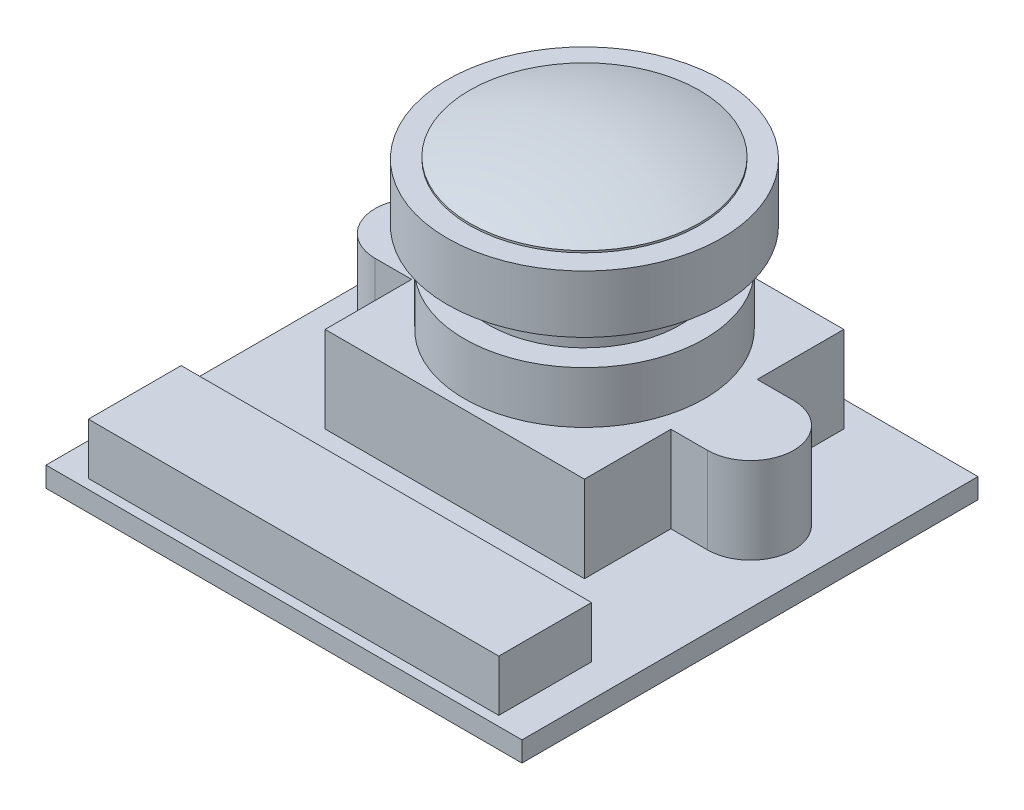
ISO-10303-21;
HEADER;
FILE_DESCRIPTION(('STEP AP214'),'2;1');
FILE_NAME('part.step','',(''),(''),'','','');
FILE_SCHEMA(('AUTOMOTIVE_DESIGN { 1 0 10303 214 1 1 1 1 }'));
ENDSEC;
DATA;
#1=APPLICATION_CONTEXT('core data for automotive mechanical design processes');
#2=APPLICATION_PROTOCOL_DEFINITION('international standard','automotive_design',2000,#1);
#3=PRODUCT_CONTEXT('',#1,'mechanical');
#4=PRODUCT('Part','Part','',(#3));
#5=PRODUCT_RELATED_PRODUCT_CATEGORY('part','',(#4));
#6=PRODUCT_DEFINITION_FORMATION('','',#4);
#7=PRODUCT_DEFINITION_CONTEXT('part definition',#1,'design');
#8=PRODUCT_DEFINITION('design','',#6,#7);
#9=PRODUCT_DEFINITION_SHAPE('','',#8);
#10=(LENGTH_UNIT() NAMED_UNIT(*) SI_UNIT(.MILLI.,.METRE.));
#11=(NAMED_UNIT(*) PLANE_ANGLE_UNIT() SI_UNIT($,.RADIAN.));
#12=(NAMED_UNIT(*) SI_UNIT($,.STERADIAN.) SOLID_ANGLE_UNIT());
#13=UNCERTAINTY_MEASURE_WITH_UNIT(LENGTH_MEASURE(1.E-05),#10,'distance_accuracy_value','');
#14=(GEOMETRIC_REPRESENTATION_CONTEXT(3) GLOBAL_UNCERTAINTY_ASSIGNED_CONTEXT((#13)) GLOBAL_UNIT_ASSIGNED_CONTEXT((#10,
#11,#12)) REPRESENTATION_CONTEXT('',''));
#15=CARTESIAN_POINT('',(0.,0.,0.));
#16=DIRECTION('',(0.,0.,1.));
#17=DIRECTION('',(1.,0.,0.));
#18=AXIS2_PLACEMENT_3D('',#15,#16,#17);
#19=CARTESIAN_POINT('',(0.,1.05,0.));
#20=DIRECTION('',(0.,-1.,0.));
#21=DIRECTION('',(0.,0.,-1.));
#22=AXIS2_PLACEMENT_3D('',#19,#20,#21);
#23=PLANE('',#22);
#24=DIRECTION('',(0.,0.,1.));
#25=VECTOR('',#24,1.);
#26=CARTESIAN_POINT('',(5.65,1.05,-22.44));
#27=LINE('',#26,#25);
#28=CARTESIAN_POINT('',(5.65,1.05,-22.44));
#29=VERTEX_POINT('',#28);
#30=CARTESIAN_POINT('',(5.65,1.05,-17.925));
#31=VERTEX_POINT('',#30);
#32=EDGE_CURVE('E63',#29,#31,#27,.T.);
#33=ORIENTED_EDGE('',*,*,#32,.F.);
#34=DIRECTION('',(-1.,0.,0.));
#35=VECTOR('',#34,1.);
#36=CARTESIAN_POINT('',(5.65,1.05,-22.44));
#37=LINE('',#36,#35);
#38=CARTESIAN_POINT('',(19.18,1.05,-22.44));
#39=VERTEX_POINT('',#38);
#40=EDGE_CURVE('E213',#39,#29,#37,.T.);
#41=ORIENTED_EDGE('',*,*,#40,.F.);
#42=DIRECTION('',(0.,0.,-1.));
#43=VECTOR('',#42,1.);
#44=CARTESIAN_POINT('',(19.18,1.05,-22.44));
#45=LINE('',#44,#43);
#46=CARTESIAN_POINT('',(19.18,1.05,-17.92));
#47=VERTEX_POINT('',#46);
#48=EDGE_CURVE('E262',#47,#39,#45,.T.);
#49=ORIENTED_EDGE('',*,*,#48,.F.);
#50=DIRECTION('',(-1.,0.,0.));
#51=VECTOR('',#50,1.);
#52=CARTESIAN_POINT('',(19.18,1.05,-17.92));
#53=LINE('',#52,#51);
#54=CARTESIAN_POINT('',(21.085,1.05,-17.92));
#55=VERTEX_POINT('',#54);
#56=EDGE_CURVE('E259',#55,#47,#53,.T.);
#57=ORIENTED_EDGE('',*,*,#56,.F.);
#58=CARTESIAN_POINT('',(21.085,1.05,-15.67));
#59=DIRECTION('',(0.,1.,0.));
#60=DIRECTION('',(0.,0.,1.));
#61=AXIS2_PLACEMENT_3D('',#58,#59,#60);
#62=CIRCLE('',#61,2.25);
#63=CARTESIAN_POINT('',(21.085,1.05,-13.42));
#64=VERTEX_POINT('',#63);
#65=EDGE_CURVE('E256',#64,#55,#62,.T.);
#66=ORIENTED_EDGE('',*,*,#65,.F.);
#67=DIRECTION('',(1.,0.,0.));
#68=VECTOR('',#67,1.);
#69=CARTESIAN_POINT('',(19.18,1.05,-13.42));
#70=LINE('',#69,#68);
#71=CARTESIAN_POINT('',(19.18,1.05,-13.42));
#72=VERTEX_POINT('',#71);
#73=EDGE_CURVE('E253',#72,#64,#70,.T.);
#74=ORIENTED_EDGE('',*,*,#73,.F.);
#75=DIRECTION('',(0.,0.,-1.));
#76=VECTOR('',#75,1.);
#77=CARTESIAN_POINT('',(19.18,1.05,-13.42));
#78=LINE('',#77,#76);
#79=CARTESIAN_POINT('',(19.18,1.05,-8.91));
#80=VERTEX_POINT('',#79);
#81=EDGE_CURVE('E250',#80,#72,#78,.T.);
#82=ORIENTED_EDGE('',*,*,#81,.F.);
#83=DIRECTION('',(1.,0.,0.));
#84=VECTOR('',#83,1.);
#85=CARTESIAN_POINT('',(5.65,1.05,-8.91));
#86=LINE('',#85,#84);
#87=CARTESIAN_POINT('',(5.65,1.05,-8.91));
#88=VERTEX_POINT('',#87);
#89=EDGE_CURVE('E247',#88,#80,#86,.T.);
#90=ORIENTED_EDGE('',*,*,#89,.F.);
#91=DIRECTION('',(0.,0.,1.));
#92=VECTOR('',#91,1.);
#93=CARTESIAN_POINT('',(5.65,1.05,-13.425));
#94=LINE('',#93,#92);
#95=CARTESIAN_POINT('',(5.65,1.05,-13.425));
#96=VERTEX_POINT('',#95);
#97=EDGE_CURVE('E244',#96,#88,#94,.T.);
#98=ORIENTED_EDGE('',*,*,#97,.F.);
#99=DIRECTION('',(1.,0.,0.));
#100=VECTOR('',#99,1.);
#101=CARTESIAN_POINT('',(3.745,1.05,-13.425));
#102=LINE('',#101,#100);
#103=CARTESIAN_POINT('',(3.745,1.05,-13.425));
#104=VERTEX_POINT('',#103);
#105=EDGE_CURVE('E241',#104,#96,#102,.T.);
#106=ORIENTED_EDGE('',*,*,#105,.F.);
#107=CARTESIAN_POINT('',(3.745,1.05,-15.675));
#108=DIRECTION('',(0.,1.,0.));
#109=DIRECTION('',(0.,0.,1.));
#110=AXIS2_PLACEMENT_3D('',#107,#108,#109);
#111=CIRCLE('',#110,2.25);
#112=CARTESIAN_POINT('',(3.745,1.05,-17.925));
#113=VERTEX_POINT('',#112);
#114=EDGE_CURVE('E238',#113,#104,#111,.T.);
#115=ORIENTED_EDGE('',*,*,#114,.F.);
#116=DIRECTION('',(-1.,0.,0.));
#117=VECTOR('',#116,1.);
#118=CARTESIAN_POINT('',(3.745,1.05,-17.925));
#119=LINE('',#118,#117);
#120=EDGE_CURVE('E203',#31,#113,#119,.T.);
#121=ORIENTED_EDGE('',*,*,#120,.F.);
#122=EDGE_LOOP('',(#33,#41,#49,#57,#66,#74,#82,#90,#98,#106,#115,#121));
#123=FACE_BOUND('',#122,.T.);
#124=DIRECTION('',(0.,0.,1.));
#125=VECTOR('',#124,1.);
#126=CARTESIAN_POINT('',(0.,1.05,0.));
#127=LINE('',#126,#125);
#128=CARTESIAN_POINT('',(0.,1.05,-23.79));
#129=VERTEX_POINT('',#128);
#130=CARTESIAN_POINT('',(0.,1.05,0.));
#131=VERTEX_POINT('',#130);
#132=EDGE_CURVE('E302',#129,#131,#127,.T.);
#133=ORIENTED_EDGE('',*,*,#132,.T.);
#134=DIRECTION('',(1.,0.,0.));
#135=VECTOR('',#134,1.);
#136=CARTESIAN_POINT('',(0.,1.05,0.));
#137=LINE('',#136,#135);
#138=CARTESIAN_POINT('',(24.83,1.05,0.));
#139=VERTEX_POINT('',#138);
#140=EDGE_CURVE('E305',#131,#139,#137,.T.);
#141=ORIENTED_EDGE('',*,*,#140,.T.);
#142=DIRECTION('',(0.,0.,-1.));
#143=VECTOR('',#142,1.);
#144=CARTESIAN_POINT('',(24.83,1.05,0.));
#145=LINE('',#144,#143);
#146=CARTESIAN_POINT('',(24.83,1.05,-23.79));
#147=VERTEX_POINT('',#146);
#148=EDGE_CURVE('E308',#139,#147,#145,.T.);
#149=ORIENTED_EDGE('',*,*,#148,.T.);
#150=DIRECTION('',(-1.,0.,0.));
#151=VECTOR('',#150,1.);
#152=CARTESIAN_POINT('',(0.,1.05,-23.79));
#153=LINE('',#152,#151);
#154=EDGE_CURVE('E310',#147,#129,#153,.T.);
#155=ORIENTED_EDGE('',*,*,#154,.T.);
#156=EDGE_LOOP('',(#133,#141,#149,#155));
#157=FACE_BOUND('',#156,.T.);
#158=DIRECTION('',(1.,0.,0.));
#159=VECTOR('',#158,1.);
#160=CARTESIAN_POINT('',(0.,1.05,-0.5));
#161=LINE('',#160,#159);
#162=CARTESIAN_POINT('',(1.71,1.05,-0.5));
#163=VERTEX_POINT('',#162);
#164=CARTESIAN_POINT('',(23.12,1.05,-0.5));
#165=VERTEX_POINT('',#164);
#166=EDGE_CURVE('E200',#163,#165,#161,.T.);
#167=ORIENTED_EDGE('',*,*,#166,.F.);
#168=DIRECTION('',(0.,0.,-1.));
#169=VECTOR('',#168,1.);
#170=CARTESIAN_POINT('',(1.71,1.05,0.));
#171=LINE('',#170,#169);
#172=CARTESIAN_POINT('',(1.71,1.05,-5.34));
#173=VERTEX_POINT('',#172);
#174=EDGE_CURVE('E196',#163,#173,#171,.T.);
#175=ORIENTED_EDGE('',*,*,#174,.T.);
#176=DIRECTION('',(1.,0.,0.));
#177=VECTOR('',#176,1.);
#178=CARTESIAN_POINT('',(0.,1.05,-5.34));
#179=LINE('',#178,#177);
#180=CARTESIAN_POINT('',(23.12,1.05,-5.34));
#181=VERTEX_POINT('',#180);
#182=EDGE_CURVE('E55',#173,#181,#179,.T.);
#183=ORIENTED_EDGE('',*,*,#182,.T.);
#184=DIRECTION('',(0.,0.,-1.));
#185=VECTOR('',#184,1.);
#186=CARTESIAN_POINT('',(23.12,1.05,0.));
#187=LINE('',#186,#185);
#188=EDGE_CURVE('E345',#165,#181,#187,.T.);
#189=ORIENTED_EDGE('',*,*,#188,.F.);
#190=EDGE_LOOP('',(#167,#175,#183,#189));
#191=FACE_BOUND('',#190,.T.);
#192=ADVANCED_FACE('F38',(#123,#157,#191),#23,.F.);
#193=CARTESIAN_POINT('',(0.,1.05,0.));
#194=DIRECTION('',(1.,0.,0.));
#195=DIRECTION('',(0.,0.,-1.));
#196=AXIS2_PLACEMENT_3D('',#193,#194,#195);
#197=PLANE('',#196);
#198=DIRECTION('',(0.,0.,1.));
#199=VECTOR('',#198,1.);
#200=CARTESIAN_POINT('',(0.,0.,0.));
#201=LINE('',#200,#199);
#202=CARTESIAN_POINT('',(0.,0.,-23.79));
#203=VERTEX_POINT('',#202);
#204=CARTESIAN_POINT('',(0.,0.,0.));
#205=VERTEX_POINT('',#204);
#206=EDGE_CURVE('E301',#203,#205,#201,.T.);
#207=ORIENTED_EDGE('',*,*,#206,.T.);
#208=DIRECTION('',(0.,-1.,0.));
#209=VECTOR('',#208,1.);
#210=CARTESIAN_POINT('',(0.,1.05,0.));
#211=LINE('',#210,#209);
#212=EDGE_CURVE('E327',#131,#205,#211,.T.);
#213=ORIENTED_EDGE('',*,*,#212,.F.);
#214=ORIENTED_EDGE('',*,*,#132,.F.);
#215=DIRECTION('',(0.,-1.,0.));
#216=VECTOR('',#215,1.);
#217=CARTESIAN_POINT('',(0.,1.05,-23.79));
#218=LINE('',#217,#216);
#219=EDGE_CURVE('E312',#129,#203,#218,.T.);
#220=ORIENTED_EDGE('',*,*,#219,.T.);
#221=EDGE_LOOP('',(#207,#213,#214,#220));
#222=FACE_BOUND('',#221,.T.);
#223=ADVANCED_FACE('F355',(#222),#197,.F.);
#224=CARTESIAN_POINT('',(0.,1.05,0.));
#225=DIRECTION('',(0.,0.,-1.));
#226=DIRECTION('',(-1.,0.,0.));
#227=AXIS2_PLACEMENT_3D('',#224,#225,#226);
#228=PLANE('',#227);
#229=DIRECTION('',(1.,0.,0.));
#230=VECTOR('',#229,1.);
#231=CARTESIAN_POINT('',(0.,0.,0.));
#232=LINE('',#231,#230);
#233=CARTESIAN_POINT('',(24.83,0.,0.));
#234=VERTEX_POINT('',#233);
#235=EDGE_CURVE('E315',#205,#234,#232,.T.);
#236=ORIENTED_EDGE('',*,*,#235,.T.);
#237=DIRECTION('',(0.,-1.,0.));
#238=VECTOR('',#237,1.);
#239=CARTESIAN_POINT('',(24.83,1.05,0.));
#240=LINE('',#239,#238);
#241=EDGE_CURVE('E325',#139,#234,#240,.T.);
#242=ORIENTED_EDGE('',*,*,#241,.F.);
#243=ORIENTED_EDGE('',*,*,#140,.F.);
#244=ORIENTED_EDGE('',*,*,#212,.T.);
#245=EDGE_LOOP('',(#236,#242,#243,#244));
#246=FACE_BOUND('',#245,.T.);
#247=ADVANCED_FACE('F360',(#246),#228,.F.);
#248=CARTESIAN_POINT('',(24.83,1.05,0.));
#249=DIRECTION('',(-1.,0.,0.));
#250=DIRECTION('',(0.,0.,1.));
#251=AXIS2_PLACEMENT_3D('',#248,#249,#250);
#252=PLANE('',#251);
#253=DIRECTION('',(0.,0.,-1.));
#254=VECTOR('',#253,1.);
#255=CARTESIAN_POINT('',(24.83,0.,0.));
#256=LINE('',#255,#254);
#257=CARTESIAN_POINT('',(24.83,0.,-23.79));
#258=VERTEX_POINT('',#257);
#259=EDGE_CURVE('E317',#234,#258,#256,.T.);
#260=ORIENTED_EDGE('',*,*,#259,.T.);
#261=DIRECTION('',(0.,-1.,0.));
#262=VECTOR('',#261,1.);
#263=CARTESIAN_POINT('',(24.83,1.05,-23.79));
#264=LINE('',#263,#262);
#265=EDGE_CURVE('E322',#147,#258,#264,.T.);
#266=ORIENTED_EDGE('',*,*,#265,.F.);
#267=ORIENTED_EDGE('',*,*,#148,.F.);
#268=ORIENTED_EDGE('',*,*,#241,.T.);
#269=EDGE_LOOP('',(#260,#266,#267,#268));
#270=FACE_BOUND('',#269,.T.);
#271=ADVANCED_FACE('F374',(#270),#252,.F.);
#272=CARTESIAN_POINT('',(0.,1.05,-23.79));
#273=DIRECTION('',(0.,0.,1.));
#274=DIRECTION('',(1.,0.,0.));
#275=AXIS2_PLACEMENT_3D('',#272,#273,#274);
#276=PLANE('',#275);
#277=DIRECTION('',(-1.,0.,0.));
#278=VECTOR('',#277,1.);
#279=CARTESIAN_POINT('',(0.,0.,-23.79));
#280=LINE('',#279,#278);
#281=EDGE_CURVE('E306',#258,#203,#280,.T.);
#282=ORIENTED_EDGE('',*,*,#281,.T.);
#283=ORIENTED_EDGE('',*,*,#219,.F.);
#284=ORIENTED_EDGE('',*,*,#154,.F.);
#285=ORIENTED_EDGE('',*,*,#265,.T.);
#286=EDGE_LOOP('',(#282,#283,#284,#285));
#287=FACE_BOUND('',#286,.T.);
#288=ADVANCED_FACE('F370',(#287),#276,.F.);
#289=CARTESIAN_POINT('',(0.,0.,0.));
#290=DIRECTION('',(0.,-1.,0.));
#291=DIRECTION('',(0.,0.,-1.));
#292=AXIS2_PLACEMENT_3D('',#289,#290,#291);
#293=PLANE('',#292);
#294=ORIENTED_EDGE('',*,*,#206,.F.);
#295=ORIENTED_EDGE('',*,*,#281,.F.);
#296=ORIENTED_EDGE('',*,*,#259,.F.);
#297=ORIENTED_EDGE('',*,*,#235,.F.);
#298=EDGE_LOOP('',(#294,#295,#296,#297));
#299=FACE_BOUND('',#298,.T.);
#300=ADVANCED_FACE('F367',(#299),#293,.T.);
#301=CARTESIAN_POINT('',(5.65,5.55,-22.44));
#302=DIRECTION('',(1.,0.,0.));
#303=DIRECTION('',(0.,0.,-1.));
#304=AXIS2_PLACEMENT_3D('',#301,#302,#303);
#305=PLANE('',#304);
#306=ORIENTED_EDGE('',*,*,#32,.T.);
#307=DIRECTION('',(0.,-1.,0.));
#308=VECTOR('',#307,1.);
#309=CARTESIAN_POINT('',(5.65,5.55,-17.925));
#310=LINE('',#309,#308);
#311=CARTESIAN_POINT('',(5.65,5.55,-17.925));
#312=VERTEX_POINT('',#311);
#313=EDGE_CURVE('E298',#312,#31,#310,.T.);
#314=ORIENTED_EDGE('',*,*,#313,.F.);
#315=DIRECTION('',(0.,0.,1.));
#316=VECTOR('',#315,1.);
#317=CARTESIAN_POINT('',(5.65,5.55,-22.44));
#318=LINE('',#317,#316);
#319=CARTESIAN_POINT('',(5.65,5.55,-22.44));
#320=VERTEX_POINT('',#319);
#321=EDGE_CURVE('E209',#320,#312,#318,.T.);
#322=ORIENTED_EDGE('',*,*,#321,.F.);
#323=DIRECTION('',(0.,-1.,0.));
#324=VECTOR('',#323,1.);
#325=CARTESIAN_POINT('',(5.65,5.55,-22.44));
#326=LINE('',#325,#324);
#327=EDGE_CURVE('E234',#320,#29,#326,.T.);
#328=ORIENTED_EDGE('',*,*,#327,.T.);
#329=EDGE_LOOP('',(#306,#314,#322,#328));
#330=FACE_BOUND('',#329,.T.);
#331=ADVANCED_FACE('F365',(#330),#305,.F.);
#332=CARTESIAN_POINT('',(3.745,5.55,-17.925));
#333=DIRECTION('',(0.,0.,1.));
#334=DIRECTION('',(1.,0.,0.));
#335=AXIS2_PLACEMENT_3D('',#332,#333,#334);
#336=PLANE('',#335);
#337=ORIENTED_EDGE('',*,*,#120,.T.);
#338=DIRECTION('',(0.,-1.,0.));
#339=VECTOR('',#338,1.);
#340=CARTESIAN_POINT('',(3.745,5.55,-17.925));
#341=LINE('',#340,#339);
#342=CARTESIAN_POINT('',(3.745,5.55,-17.925));
#343=VERTEX_POINT('',#342);
#344=EDGE_CURVE('E295',#343,#113,#341,.T.);
#345=ORIENTED_EDGE('',*,*,#344,.F.);
#346=DIRECTION('',(-1.,0.,0.));
#347=VECTOR('',#346,1.);
#348=CARTESIAN_POINT('',(3.745,5.55,-17.925));
#349=LINE('',#348,#347);
#350=EDGE_CURVE('E212',#312,#343,#349,.T.);
#351=ORIENTED_EDGE('',*,*,#350,.F.);
#352=ORIENTED_EDGE('',*,*,#313,.T.);
#353=EDGE_LOOP('',(#337,#345,#351,#352));
#354=FACE_BOUND('',#353,.T.);
#355=ADVANCED_FACE('F411',(#354),#336,.F.);
#356=CARTESIAN_POINT('',(3.745,5.55,-15.675));
#357=DIRECTION('',(0.,-1.,0.));
#358=DIRECTION('',(0.,0.,-1.));
#359=AXIS2_PLACEMENT_3D('',#356,#357,#358);
#360=CYLINDRICAL_SURFACE('',#359,2.25);
#361=ORIENTED_EDGE('',*,*,#114,.T.);
#362=DIRECTION('',(0.,-1.,0.));
#363=VECTOR('',#362,1.);
#364=CARTESIAN_POINT('',(3.745,5.55,-13.425));
#365=LINE('',#364,#363);
#366=CARTESIAN_POINT('',(3.745,5.55,-13.425));
#367=VERTEX_POINT('',#366);
#368=EDGE_CURVE('E292',#367,#104,#365,.T.);
#369=ORIENTED_EDGE('',*,*,#368,.F.);
#370=CARTESIAN_POINT('',(3.745,5.55,-15.675));
#371=DIRECTION('',(0.,1.,0.));
#372=DIRECTION('',(0.,0.,1.));
#373=AXIS2_PLACEMENT_3D('',#370,#371,#372);
#374=CIRCLE('',#373,2.25);
#375=EDGE_CURVE('E215',#343,#367,#374,.T.);
#376=ORIENTED_EDGE('',*,*,#375,.F.);
#377=ORIENTED_EDGE('',*,*,#344,.T.);
#378=EDGE_LOOP('',(#361,#369,#376,#377));
#379=FACE_BOUND('',#378,.T.);
#380=ADVANCED_FACE('F418',(#379),#360,.T.);
#381=CARTESIAN_POINT('',(3.745,5.55,-13.425));
#382=DIRECTION('',(0.,0.,-1.));
#383=DIRECTION('',(-1.,0.,0.));
#384=AXIS2_PLACEMENT_3D('',#381,#382,#383);
#385=PLANE('',#384);
#386=ORIENTED_EDGE('',*,*,#105,.T.);
#387=DIRECTION('',(0.,-1.,0.));
#388=VECTOR('',#387,1.);
#389=CARTESIAN_POINT('',(5.65,5.55,-13.425));
#390=LINE('',#389,#388);
#391=CARTESIAN_POINT('',(5.65,5.55,-13.425));
#392=VERTEX_POINT('',#391);
#393=EDGE_CURVE('E289',#392,#96,#390,.T.);
#394=ORIENTED_EDGE('',*,*,#393,.F.);
#395=DIRECTION('',(1.,0.,0.));
#396=VECTOR('',#395,1.);
#397=CARTESIAN_POINT('',(3.745,5.55,-13.425));
#398=LINE('',#397,#396);
#399=EDGE_CURVE('E217',#367,#392,#398,.T.);
#400=ORIENTED_EDGE('',*,*,#399,.F.);
#401=ORIENTED_EDGE('',*,*,#368,.T.);
#402=EDGE_LOOP('',(#386,#394,#400,#401));
#403=FACE_BOUND('',#402,.T.);
#404=ADVANCED_FACE('F425',(#403),#385,.F.);
#405=CARTESIAN_POINT('',(5.65,5.55,-13.425));
#406=DIRECTION('',(1.,0.,0.));
#407=DIRECTION('',(0.,0.,-1.));
#408=AXIS2_PLACEMENT_3D('',#405,#406,#407);
#409=PLANE('',#408);
#410=ORIENTED_EDGE('',*,*,#97,.T.);
#411=DIRECTION('',(0.,-1.,0.));
#412=VECTOR('',#411,1.);
#413=CARTESIAN_POINT('',(5.65,5.55,-8.91));
#414=LINE('',#413,#412);
#415=CARTESIAN_POINT('',(5.65,5.55,-8.91));
#416=VERTEX_POINT('',#415);
#417=EDGE_CURVE('E286',#416,#88,#414,.T.);
#418=ORIENTED_EDGE('',*,*,#417,.F.);
#419=DIRECTION('',(0.,0.,1.));
#420=VECTOR('',#419,1.);
#421=CARTESIAN_POINT('',(5.65,5.55,-13.425));
#422=LINE('',#421,#420);
#423=EDGE_CURVE('E219',#392,#416,#422,.T.);
#424=ORIENTED_EDGE('',*,*,#423,.F.);
#425=ORIENTED_EDGE('',*,*,#393,.T.);
#426=EDGE_LOOP('',(#410,#418,#424,#425));
#427=FACE_BOUND('',#426,.T.);
#428=ADVANCED_FACE('F433',(#427),#409,.F.);
#429=CARTESIAN_POINT('',(5.65,5.55,-8.91));
#430=DIRECTION('',(0.,0.,-1.));
#431=DIRECTION('',(-1.,0.,0.));
#432=AXIS2_PLACEMENT_3D('',#429,#430,#431);
#433=PLANE('',#432);
#434=ORIENTED_EDGE('',*,*,#89,.T.);
#435=DIRECTION('',(0.,-1.,0.));
#436=VECTOR('',#435,1.);
#437=CARTESIAN_POINT('',(19.18,5.55,-8.91));
#438=LINE('',#437,#436);
#439=CARTESIAN_POINT('',(19.18,5.55,-8.91));
#440=VERTEX_POINT('',#439);
#441=EDGE_CURVE('E283',#440,#80,#438,.T.);
#442=ORIENTED_EDGE('',*,*,#441,.F.);
#443=DIRECTION('',(1.,0.,0.));
#444=VECTOR('',#443,1.);
#445=CARTESIAN_POINT('',(5.65,5.55,-8.91));
#446=LINE('',#445,#444);
#447=EDGE_CURVE('E221',#416,#440,#446,.T.);
#448=ORIENTED_EDGE('',*,*,#447,.F.);
#449=ORIENTED_EDGE('',*,*,#417,.T.);
#450=EDGE_LOOP('',(#434,#442,#448,#449));
#451=FACE_BOUND('',#450,.T.);
#452=ADVANCED_FACE('F441',(#451),#433,.F.);
#453=CARTESIAN_POINT('',(19.18,5.55,-13.42));
#454=DIRECTION('',(-1.,0.,0.));
#455=DIRECTION('',(0.,0.,1.));
#456=AXIS2_PLACEMENT_3D('',#453,#454,#455);
#457=PLANE('',#456);
#458=ORIENTED_EDGE('',*,*,#81,.T.);
#459=DIRECTION('',(0.,-1.,0.));
#460=VECTOR('',#459,1.);
#461=CARTESIAN_POINT('',(19.18,5.55,-13.42));
#462=LINE('',#461,#460);
#463=CARTESIAN_POINT('',(19.18,5.55,-13.42));
#464=VERTEX_POINT('',#463);
#465=EDGE_CURVE('E280',#464,#72,#462,.T.);
#466=ORIENTED_EDGE('',*,*,#465,.F.);
#467=DIRECTION('',(0.,0.,-1.));
#468=VECTOR('',#467,1.);
#469=CARTESIAN_POINT('',(19.18,5.55,-13.42));
#470=LINE('',#469,#468);
#471=EDGE_CURVE('E223',#440,#464,#470,.T.);
#472=ORIENTED_EDGE('',*,*,#471,.F.);
#473=ORIENTED_EDGE('',*,*,#441,.T.);
#474=EDGE_LOOP('',(#458,#466,#472,#473));
#475=FACE_BOUND('',#474,.T.);
#476=ADVANCED_FACE('F449',(#475),#457,.F.);
#477=CARTESIAN_POINT('',(19.18,5.55,-13.42));
#478=DIRECTION('',(0.,0.,-1.));
#479=DIRECTION('',(-1.,0.,0.));
#480=AXIS2_PLACEMENT_3D('',#477,#478,#479);
#481=PLANE('',#480);
#482=ORIENTED_EDGE('',*,*,#73,.T.);
#483=DIRECTION('',(0.,-1.,0.));
#484=VECTOR('',#483,1.);
#485=CARTESIAN_POINT('',(21.085,5.55,-13.42));
#486=LINE('',#485,#484);
#487=CARTESIAN_POINT('',(21.085,5.55,-13.42));
#488=VERTEX_POINT('',#487);
#489=EDGE_CURVE('E277',#488,#64,#486,.T.);
#490=ORIENTED_EDGE('',*,*,#489,.F.);
#491=DIRECTION('',(1.,0.,0.));
#492=VECTOR('',#491,1.);
#493=CARTESIAN_POINT('',(19.18,5.55,-13.42));
#494=LINE('',#493,#492);
#495=EDGE_CURVE('E225',#464,#488,#494,.T.);
#496=ORIENTED_EDGE('',*,*,#495,.F.);
#497=ORIENTED_EDGE('',*,*,#465,.T.);
#498=EDGE_LOOP('',(#482,#490,#496,#497));
#499=FACE_BOUND('',#498,.T.);
#500=ADVANCED_FACE('F457',(#499),#481,.F.);
#501=CARTESIAN_POINT('',(21.085,5.55,-15.67));
#502=DIRECTION('',(0.,-1.,0.));
#503=DIRECTION('',(0.,0.,-1.));
#504=AXIS2_PLACEMENT_3D('',#501,#502,#503);
#505=CYLINDRICAL_SURFACE('',#504,2.25);
#506=ORIENTED_EDGE('',*,*,#65,.T.);
#507=DIRECTION('',(0.,-1.,0.));
#508=VECTOR('',#507,1.);
#509=CARTESIAN_POINT('',(21.085,5.55,-17.92));
#510=LINE('',#509,#508);
#511=CARTESIAN_POINT('',(21.085,5.55,-17.92));
#512=VERTEX_POINT('',#511);
#513=EDGE_CURVE('E274',#512,#55,#510,.T.);
#514=ORIENTED_EDGE('',*,*,#513,.F.);
#515=CARTESIAN_POINT('',(21.085,5.55,-15.67));
#516=DIRECTION('',(0.,1.,0.));
#517=DIRECTION('',(0.,0.,1.));
#518=AXIS2_PLACEMENT_3D('',#515,#516,#517);
#519=CIRCLE('',#518,2.25);
#520=EDGE_CURVE('E227',#488,#512,#519,.T.);
#521=ORIENTED_EDGE('',*,*,#520,.F.);
#522=ORIENTED_EDGE('',*,*,#489,.T.);
#523=EDGE_LOOP('',(#506,#514,#521,#522));
#524=FACE_BOUND('',#523,.T.);
#525=ADVANCED_FACE('F465',(#524),#505,.T.);
#526=CARTESIAN_POINT('',(19.18,5.55,-17.92));
#527=DIRECTION('',(0.,0.,1.));
#528=DIRECTION('',(1.,0.,0.));
#529=AXIS2_PLACEMENT_3D('',#526,#527,#528);
#530=PLANE('',#529);
#531=ORIENTED_EDGE('',*,*,#56,.T.);
#532=DIRECTION('',(0.,-1.,0.));
#533=VECTOR('',#532,1.);
#534=CARTESIAN_POINT('',(19.18,5.55,-17.92));
#535=LINE('',#534,#533);
#536=CARTESIAN_POINT('',(19.18,5.55,-17.92));
#537=VERTEX_POINT('',#536);
#538=EDGE_CURVE('E271',#537,#47,#535,.T.);
#539=ORIENTED_EDGE('',*,*,#538,.F.);
#540=DIRECTION('',(-1.,0.,0.));
#541=VECTOR('',#540,1.);
#542=CARTESIAN_POINT('',(19.18,5.55,-17.92));
#543=LINE('',#542,#541);
#544=EDGE_CURVE('E229',#512,#537,#543,.T.);
#545=ORIENTED_EDGE('',*,*,#544,.F.);
#546=ORIENTED_EDGE('',*,*,#513,.T.);
#547=EDGE_LOOP('',(#531,#539,#545,#546));
#548=FACE_BOUND('',#547,.T.);
#549=ADVANCED_FACE('F473',(#548),#530,.F.);
#550=CARTESIAN_POINT('',(19.18,5.55,-22.44));
#551=DIRECTION('',(-1.,0.,0.));
#552=DIRECTION('',(0.,0.,1.));
#553=AXIS2_PLACEMENT_3D('',#550,#551,#552);
#554=PLANE('',#553);
#555=ORIENTED_EDGE('',*,*,#48,.T.);
#556=DIRECTION('',(0.,-1.,0.));
#557=VECTOR('',#556,1.);
#558=CARTESIAN_POINT('',(19.18,5.55,-22.44));
#559=LINE('',#558,#557);
#560=CARTESIAN_POINT('',(19.18,5.55,-22.44));
#561=VERTEX_POINT('',#560);
#562=EDGE_CURVE('E268',#561,#39,#559,.T.);
#563=ORIENTED_EDGE('',*,*,#562,.F.);
#564=DIRECTION('',(0.,0.,-1.));
#565=VECTOR('',#564,1.);
#566=CARTESIAN_POINT('',(19.18,5.55,-22.44));
#567=LINE('',#566,#565);
#568=EDGE_CURVE('E231',#537,#561,#567,.T.);
#569=ORIENTED_EDGE('',*,*,#568,.F.);
#570=ORIENTED_EDGE('',*,*,#538,.T.);
#571=EDGE_LOOP('',(#555,#563,#569,#570));
#572=FACE_BOUND('',#571,.T.);
#573=ADVANCED_FACE('F481',(#572),#554,.F.);
#574=CARTESIAN_POINT('',(5.65,5.55,-22.44));
#575=DIRECTION('',(0.,0.,1.));
#576=DIRECTION('',(1.,0.,0.));
#577=AXIS2_PLACEMENT_3D('',#574,#575,#576);
#578=PLANE('',#577);
#579=ORIENTED_EDGE('',*,*,#40,.T.);
#580=ORIENTED_EDGE('',*,*,#327,.F.);
#581=DIRECTION('',(-1.,0.,0.));
#582=VECTOR('',#581,1.);
#583=CARTESIAN_POINT('',(5.65,5.55,-22.44));
#584=LINE('',#583,#582);
#585=EDGE_CURVE('E233',#561,#320,#584,.T.);
#586=ORIENTED_EDGE('',*,*,#585,.F.);
#587=ORIENTED_EDGE('',*,*,#562,.T.);
#588=EDGE_LOOP('',(#579,#580,#586,#587));
#589=FACE_BOUND('',#588,.T.);
#590=ADVANCED_FACE('F489',(#589),#578,.F.);
#591=CARTESIAN_POINT('',(3.745,5.55,-15.675));
#592=DIRECTION('',(0.,1.,0.));
#593=DIRECTION('',(0.,0.,1.));
#594=AXIS2_PLACEMENT_3D('',#591,#592,#593);
#595=PLANE('',#594);
#596=CARTESIAN_POINT('',(12.415,5.55,-15.675));
#597=DIRECTION('',(0.,1.,0.));
#598=DIRECTION('',(0.,0.,1.));
#599=AXIS2_PLACEMENT_3D('',#596,#597,#598);
#600=CIRCLE('',#599,6.265);
#601=CARTESIAN_POINT('',(12.415,5.55,-21.94));
#602=VERTEX_POINT('',#601);
#603=EDGE_CURVE('E329',#602,#602,#600,.T.);
#604=ORIENTED_EDGE('',*,*,#603,.F.);
#605=EDGE_LOOP('',(#604));
#606=FACE_BOUND('',#605,.T.);
#607=ORIENTED_EDGE('',*,*,#321,.T.);
#608=ORIENTED_EDGE('',*,*,#350,.T.);
#609=ORIENTED_EDGE('',*,*,#375,.T.);
#610=ORIENTED_EDGE('',*,*,#399,.T.);
#611=ORIENTED_EDGE('',*,*,#423,.T.);
#612=ORIENTED_EDGE('',*,*,#447,.T.);
#613=ORIENTED_EDGE('',*,*,#471,.T.);
#614=ORIENTED_EDGE('',*,*,#495,.T.);
#615=ORIENTED_EDGE('',*,*,#520,.T.);
#616=ORIENTED_EDGE('',*,*,#544,.T.);
#617=ORIENTED_EDGE('',*,*,#568,.T.);
#618=ORIENTED_EDGE('',*,*,#585,.T.);
#619=EDGE_LOOP('',(#607,#608,#609,#610,#611,#612,#613,#614,#615,#616,#617,#618));
#620=FACE_BOUND('',#619,.T.);
#621=ADVANCED_FACE('F497',(#606,#620),#595,.T.);
#622=CARTESIAN_POINT('',(0.,3.73,-0.5));
#623=DIRECTION('',(0.,0.,-1.));
#624=DIRECTION('',(-1.,0.,0.));
#625=AXIS2_PLACEMENT_3D('',#622,#623,#624);
#626=PLANE('',#625);
#627=ORIENTED_EDGE('',*,*,#166,.T.);
#628=DIRECTION('',(0.,-1.,0.));
#629=VECTOR('',#628,1.);
#630=CARTESIAN_POINT('',(23.12,3.73,-0.5));
#631=LINE('',#630,#629);
#632=CARTESIAN_POINT('',(23.12,3.73,-0.5));
#633=VERTEX_POINT('',#632);
#634=EDGE_CURVE('E181',#633,#165,#631,.T.);
#635=ORIENTED_EDGE('',*,*,#634,.F.);
#636=DIRECTION('',(1.,0.,0.));
#637=VECTOR('',#636,1.);
#638=CARTESIAN_POINT('',(0.,3.73,-0.5));
#639=LINE('',#638,#637);
#640=CARTESIAN_POINT('',(1.71,3.73,-0.5));
#641=VERTEX_POINT('',#640);
#642=EDGE_CURVE('E188',#641,#633,#639,.T.);
#643=ORIENTED_EDGE('',*,*,#642,.F.);
#644=DIRECTION('',(0.,-1.,0.));
#645=VECTOR('',#644,1.);
#646=CARTESIAN_POINT('',(1.71,3.73,-0.5));
#647=LINE('',#646,#645);
#648=EDGE_CURVE('E343',#641,#163,#647,.T.);
#649=ORIENTED_EDGE('',*,*,#648,.T.);
#650=EDGE_LOOP('',(#627,#635,#643,#649));
#651=FACE_BOUND('',#650,.T.);
#652=ADVANCED_FACE('F198',(#651),#626,.F.);
#653=CARTESIAN_POINT('',(23.12,3.73,0.));
#654=DIRECTION('',(-1.,0.,0.));
#655=DIRECTION('',(0.,0.,1.));
#656=AXIS2_PLACEMENT_3D('',#653,#654,#655);
#657=PLANE('',#656);
#658=ORIENTED_EDGE('',*,*,#188,.T.);
#659=DIRECTION('',(0.,-1.,0.));
#660=VECTOR('',#659,1.);
#661=CARTESIAN_POINT('',(23.12,3.73,-5.34));
#662=LINE('',#661,#660);
#663=CARTESIAN_POINT('',(23.12,3.73,-5.34));
#664=VERTEX_POINT('',#663);
#665=EDGE_CURVE('E183',#664,#181,#662,.T.);
#666=ORIENTED_EDGE('',*,*,#665,.F.);
#667=DIRECTION('',(0.,0.,-1.));
#668=VECTOR('',#667,1.);
#669=CARTESIAN_POINT('',(23.12,3.73,0.));
#670=LINE('',#669,#668);
#671=EDGE_CURVE('E176',#633,#664,#670,.T.);
#672=ORIENTED_EDGE('',*,*,#671,.F.);
#673=ORIENTED_EDGE('',*,*,#634,.T.);
#674=EDGE_LOOP('',(#658,#666,#672,#673));
#675=FACE_BOUND('',#674,.T.);
#676=ADVANCED_FACE('F179',(#675),#657,.F.);
#677=CARTESIAN_POINT('',(0.,3.73,-5.34));
#678=DIRECTION('',(0.,0.,-1.));
#679=DIRECTION('',(-1.,0.,0.));
#680=AXIS2_PLACEMENT_3D('',#677,#678,#679);
#681=PLANE('',#680);
#682=ORIENTED_EDGE('',*,*,#182,.F.);
#683=DIRECTION('',(0.,-1.,0.));
#684=VECTOR('',#683,1.);
#685=CARTESIAN_POINT('',(1.71,3.73,-5.34));
#686=LINE('',#685,#684);
#687=CARTESIAN_POINT('',(1.71,3.73,-5.34));
#688=VERTEX_POINT('',#687);
#689=EDGE_CURVE('E205',#688,#173,#686,.T.);
#690=ORIENTED_EDGE('',*,*,#689,.F.);
#691=DIRECTION('',(1.,0.,0.));
#692=VECTOR('',#691,1.);
#693=CARTESIAN_POINT('',(0.,3.73,-5.34));
#694=LINE('',#693,#692);
#695=EDGE_CURVE('E187',#688,#664,#694,.T.);
#696=ORIENTED_EDGE('',*,*,#695,.T.);
#697=ORIENTED_EDGE('',*,*,#665,.T.);
#698=EDGE_LOOP('',(#682,#690,#696,#697));
#699=FACE_BOUND('',#698,.T.);
#700=ADVANCED_FACE('F520',(#699),#681,.T.);
#701=CARTESIAN_POINT('',(1.71,3.73,0.));
#702=DIRECTION('',(-1.,0.,0.));
#703=DIRECTION('',(0.,0.,1.));
#704=AXIS2_PLACEMENT_3D('',#701,#702,#703);
#705=PLANE('',#704);
#706=ORIENTED_EDGE('',*,*,#174,.F.);
#707=ORIENTED_EDGE('',*,*,#648,.F.);
#708=DIRECTION('',(0.,0.,-1.));
#709=VECTOR('',#708,1.);
#710=CARTESIAN_POINT('',(1.71,3.73,0.));
#711=LINE('',#710,#709);
#712=EDGE_CURVE('E194',#641,#688,#711,.T.);
#713=ORIENTED_EDGE('',*,*,#712,.T.);
#714=ORIENTED_EDGE('',*,*,#689,.T.);
#715=EDGE_LOOP('',(#706,#707,#713,#714));
#716=FACE_BOUND('',#715,.T.);
#717=ADVANCED_FACE('F352',(#716),#705,.T.);
#718=CARTESIAN_POINT('',(0.,3.73,0.));
#719=DIRECTION('',(0.,1.,0.));
#720=DIRECTION('',(0.,0.,1.));
#721=AXIS2_PLACEMENT_3D('',#718,#719,#720);
#722=PLANE('',#721);
#723=ORIENTED_EDGE('',*,*,#642,.T.);
#724=ORIENTED_EDGE('',*,*,#671,.T.);
#725=ORIENTED_EDGE('',*,*,#695,.F.);
#726=ORIENTED_EDGE('',*,*,#712,.F.);
#727=EDGE_LOOP('',(#723,#724,#725,#726));
#728=FACE_BOUND('',#727,.T.);
#729=ADVANCED_FACE('F192',(#728),#722,.T.);
#730=CARTESIAN_POINT('',(12.415,8.25,-15.675));
#731=DIRECTION('',(0.,-1.,0.));
#732=DIRECTION('',(0.,0.,-1.));
#733=AXIS2_PLACEMENT_3D('',#730,#731,#732);
#734=CYLINDRICAL_SURFACE('',#733,6.265);
#735=CARTESIAN_POINT('',(12.415,8.25,-15.675));
#736=DIRECTION('',(0.,1.,0.));
#737=DIRECTION('',(0.,0.,1.));
#738=AXIS2_PLACEMENT_3D('',#735,#736,#737);
#739=CIRCLE('',#738,6.265);
#740=CARTESIAN_POINT('',(12.415,8.25,-21.94));
#741=VERTEX_POINT('',#740);
#742=EDGE_CURVE('E339',#741,#741,#739,.T.);
#743=CARTESIAN_POINT('',(12.415,8.25,-21.94));
#744=CARTESIAN_POINT('',(12.415,8.221875,-21.94));
#745=CARTESIAN_POINT('',(12.415,8.19375,-21.94));
#746=CARTESIAN_POINT('',(12.415,8.1375,-21.94));
#747=CARTESIAN_POINT('',(12.415,8.109375,-21.94));
#748=CARTESIAN_POINT('',(12.415,8.053125,-21.94));
#749=CARTESIAN_POINT('',(12.415,8.025,-21.94));
#750=CARTESIAN_POINT('',(12.415,7.96875,-21.94));
#751=CARTESIAN_POINT('',(12.415,7.940625,-21.94));
#752=CARTESIAN_POINT('',(12.415,7.884375,-21.94));
#753=CARTESIAN_POINT('',(12.415,7.85625,-21.94));
#754=CARTESIAN_POINT('',(12.415,7.8,-21.94));
#755=CARTESIAN_POINT('',(12.415,7.771875,-21.94));
#756=CARTESIAN_POINT('',(12.415,7.715625,-21.94));
#757=CARTESIAN_POINT('',(12.415,7.6875,-21.94));
#758=CARTESIAN_POINT('',(12.415,7.63125,-21.94));
#759=CARTESIAN_POINT('',(12.415,7.603125,-21.94));
#760=CARTESIAN_POINT('',(12.415,7.546875,-21.94));
#761=CARTESIAN_POINT('',(12.415,7.51875,-21.94));
#762=CARTESIAN_POINT('',(12.415,7.4625,-21.94));
#763=CARTESIAN_POINT('',(12.415,7.434375,-21.94));
#764=CARTESIAN_POINT('',(12.415,7.378125,-21.94));
#765=CARTESIAN_POINT('',(12.415,7.35,-21.94));
#766=CARTESIAN_POINT('',(12.415,7.29375,-21.94));
#767=CARTESIAN_POINT('',(12.415,7.265625,-21.94));
#768=CARTESIAN_POINT('',(12.415,7.209375,-21.94));
#769=CARTESIAN_POINT('',(12.415,7.18125,-21.94));
#770=CARTESIAN_POINT('',(12.415,7.125,-21.94));
#771=CARTESIAN_POINT('',(12.415,7.096875,-21.94));
#772=CARTESIAN_POINT('',(12.415,7.040625,-21.94));
#773=CARTESIAN_POINT('',(12.415,7.0125,-21.94));
#774=CARTESIAN_POINT('',(12.415,6.95625,-21.94));
#775=CARTESIAN_POINT('',(12.415,6.928125,-21.94));
#776=CARTESIAN_POINT('',(12.415,6.871875,-21.94));
#777=CARTESIAN_POINT('',(12.415,6.84375,-21.94));
#778=CARTESIAN_POINT('',(12.415,6.7875,-21.94));
#779=CARTESIAN_POINT('',(12.415,6.759375,-21.94));
#780=CARTESIAN_POINT('',(12.415,6.703125,-21.94));
#781=CARTESIAN_POINT('',(12.415,6.675,-21.94));
#782=CARTESIAN_POINT('',(12.415,6.61875,-21.94));
#783=CARTESIAN_POINT('',(12.415,6.590625,-21.94));
#784=CARTESIAN_POINT('',(12.415,6.534375,-21.94));
#785=CARTESIAN_POINT('',(12.415,6.50625,-21.94));
#786=CARTESIAN_POINT('',(12.415,6.45,-21.94));
#787=CARTESIAN_POINT('',(12.415,6.421875,-21.94));
#788=CARTESIAN_POINT('',(12.415,6.365625,-21.94));
#789=CARTESIAN_POINT('',(12.415,6.3375,-21.94));
#790=CARTESIAN_POINT('',(12.415,6.28125,-21.94));
#791=CARTESIAN_POINT('',(12.415,6.253125,-21.94));
#792=CARTESIAN_POINT('',(12.415,6.196875,-21.94));
#793=CARTESIAN_POINT('',(12.415,6.16875,-21.94));
#794=CARTESIAN_POINT('',(12.415,6.1125,-21.94));
#795=CARTESIAN_POINT('',(12.415,6.084375,-21.94));
#796=CARTESIAN_POINT('',(12.415,6.028125,-21.94));
#797=CARTESIAN_POINT('',(12.415,6.,-21.94));
#798=CARTESIAN_POINT('',(12.415,5.94375,-21.94));
#799=CARTESIAN_POINT('',(12.415,5.915625,-21.94));
#800=CARTESIAN_POINT('',(12.415,5.859375,-21.94));
#801=CARTESIAN_POINT('',(12.415,5.83125,-21.94));
#802=CARTESIAN_POINT('',(12.415,5.775,-21.94));
#803=CARTESIAN_POINT('',(12.415,5.746875,-21.94));
#804=CARTESIAN_POINT('',(12.415,5.690625,-21.94));
#805=CARTESIAN_POINT('',(12.415,5.6625,-21.94));
#806=CARTESIAN_POINT('',(12.415,5.60625,-21.94));
#807=CARTESIAN_POINT('',(12.415,5.578125,-21.94));
#808=CARTESIAN_POINT('',(12.415,5.55,-21.94));
#809=B_SPLINE_CURVE_WITH_KNOTS('',3,(#743,#744,#745,#746,#747,#748,#749,#750,#751,#752,#753,
#754,#755,#756,#757,#758,#759,#760,#761,#762,#763,#764,#765,#766,#767,#768,#769,#770,#771,#772,
#773,#774,#775,#776,#777,#778,#779,#780,#781,#782,#783,#784,#785,#786,#787,#788,#789,#790,#791,
#792,#793,#794,#795,#796,#797,#798,#799,#800,#801,#802,#803,#804,#805,#806,#807,#808),
.UNSPECIFIED.,.F.,.F.,(4,2,2,2,2,2,2,2,2,2,2,2,2,2,2,2,2,2,2,2,2,2,2,2,2,2,2,2,2,2,2,2,4),(0.,
0.0843749999999994,0.168749999999999,0.253125,0.337499999999999,0.421874999999999,
0.506249999999999,0.590624999999999,0.674999999999999,0.759375,0.843749999999999,
0.928124999999999,1.0125,1.096875,1.18125,1.265625,1.35,1.434375,1.51875,1.603125,1.6875,
1.771875,1.85625,1.940625,2.025,2.109375,2.19375,2.278125,2.3625,2.446875,2.53125,2.615625,2.7),.UNSPECIFIED.);
#810=EDGE_CURVE('BSEAM538',#741,#602,#809,.T.);
#811=ORIENTED_EDGE('',*,*,#742,.F.);
#812=ORIENTED_EDGE('',*,*,#603,.T.);
#813=ORIENTED_EDGE('',*,*,#810,.T.);
#814=ORIENTED_EDGE('',*,*,#810,.F.);
#815=EDGE_LOOP('',(#811,#813,#812,#814));
#816=FACE_BOUND('',#815,.T.);
#817=ADVANCED_FACE('F538',(#816),#734,.T.);
#818=CARTESIAN_POINT('',(12.415,8.25,-15.675));
#819=DIRECTION('',(0.,1.,0.));
#820=DIRECTION('',(0.,0.,1.));
#821=AXIS2_PLACEMENT_3D('',#818,#819,#820);
#822=PLANE('',#821);
#823=CARTESIAN_POINT('',(12.415,8.25,-15.675));
#824=DIRECTION('',(0.,1.,0.));
#825=DIRECTION('',(0.,0.,1.));
#826=AXIS2_PLACEMENT_3D('',#823,#824,#825);
#827=CIRCLE('',#826,5.);
#828=CARTESIAN_POINT('',(12.415,8.25,-10.675));
#829=VERTEX_POINT('',#828);
#830=EDGE_CURVE('E47',#829,#829,#827,.T.);
#831=ORIENTED_EDGE('',*,*,#830,.F.);
#832=EDGE_LOOP('',(#831));
#833=FACE_BOUND('',#832,.T.);
#834=ORIENTED_EDGE('',*,*,#742,.T.);
#835=EDGE_LOOP('',(#834));
#836=FACE_BOUND('',#835,.T.);
#837=ADVANCED_FACE('F544',(#833,#836),#822,.T.);
#838=CARTESIAN_POINT('',(12.415,10.25,-15.675));
#839=DIRECTION('',(0.,-1.,0.));
#840=DIRECTION('',(0.,0.,-1.));
#841=AXIS2_PLACEMENT_3D('',#838,#839,#840);
#842=CYLINDRICAL_SURFACE('',#841,5.);
#843=CARTESIAN_POINT('',(12.415,10.25,-15.675));
#844=DIRECTION('',(0.,1.,0.));
#845=DIRECTION('',(0.,0.,1.));
#846=AXIS2_PLACEMENT_3D('',#843,#844,#845);
#847=CIRCLE('',#846,5.);
#848=CARTESIAN_POINT('',(12.415,10.25,-10.675));
#849=VERTEX_POINT('',#848);
#850=EDGE_CURVE('E678',#849,#849,#847,.T.);
#851=ORIENTED_EDGE('',*,*,#850,.F.);
#852=EDGE_LOOP('',(#851));
#853=FACE_BOUND('',#852,.T.);
#854=ORIENTED_EDGE('',*,*,#830,.T.);
#855=EDGE_LOOP('',(#854));
#856=FACE_BOUND('',#855,.T.);
#857=ADVANCED_FACE('F552',(#853,#856),#842,.T.);
#858=CARTESIAN_POINT('',(12.415,13.25,-15.675));
#859=DIRECTION('',(0.,-1.,0.));
#860=DIRECTION('',(0.,0.,-1.));
#861=AXIS2_PLACEMENT_3D('',#858,#859,#860);
#862=CYLINDRICAL_SURFACE('',#861,7.16);
#863=CARTESIAN_POINT('',(12.415,13.25,-15.675));
#864=DIRECTION('',(0.,1.,0.));
#865=DIRECTION('',(0.,0.,1.));
#866=AXIS2_PLACEMENT_3D('',#863,#864,#865);
#867=CIRCLE('',#866,7.16);
#868=CARTESIAN_POINT('',(12.415,13.25,-8.515));
#869=VERTEX_POINT('',#868);
#870=EDGE_CURVE('E673',#869,#869,#867,.T.);
#871=ORIENTED_EDGE('',*,*,#870,.F.);
#872=EDGE_LOOP('',(#871));
#873=FACE_BOUND('',#872,.T.);
#874=CARTESIAN_POINT('',(12.415,10.25,-15.675));
#875=DIRECTION('',(0.,1.,0.));
#876=DIRECTION('',(0.,0.,1.));
#877=AXIS2_PLACEMENT_3D('',#874,#875,#876);
#878=CIRCLE('',#877,7.16);
#879=CARTESIAN_POINT('',(12.415,10.25,-8.515));
#880=VERTEX_POINT('',#879);
#881=EDGE_CURVE('E671',#880,#880,#878,.T.);
#882=ORIENTED_EDGE('',*,*,#881,.T.);
#883=EDGE_LOOP('',(#882));
#884=FACE_BOUND('',#883,.T.);
#885=ADVANCED_FACE('F560',(#873,#884),#862,.T.);
#886=CARTESIAN_POINT('',(12.415,13.25,-15.675));
#887=DIRECTION('',(0.,1.,0.));
#888=DIRECTION('',(0.,0.,1.));
#889=AXIS2_PLACEMENT_3D('',#886,#887,#888);
#890=PLANE('',#889);
#891=CARTESIAN_POINT('',(12.415,13.25,-15.675));
#892=DIRECTION('',(0.,1.,0.));
#893=DIRECTION('',(0.,0.,1.));
#894=AXIS2_PLACEMENT_3D('',#891,#892,#893);
#895=CIRCLE('',#894,6.);
#896=CARTESIAN_POINT('',(12.415,13.25,-9.675));
#897=VERTEX_POINT('',#896);
#898=EDGE_CURVE('E11',#897,#897,#895,.T.);
#899=ORIENTED_EDGE('',*,*,#898,.F.);
#900=EDGE_LOOP('',(#899));
#901=FACE_BOUND('',#900,.T.);
#902=ORIENTED_EDGE('',*,*,#870,.T.);
#903=EDGE_LOOP('',(#902));
#904=FACE_BOUND('',#903,.T.);
#905=ADVANCED_FACE('F568',(#901,#904),#890,.T.);
#906=CARTESIAN_POINT('',(12.415,10.25,-15.675));
#907=DIRECTION('',(0.,1.,0.));
#908=DIRECTION('',(0.,0.,1.));
#909=AXIS2_PLACEMENT_3D('',#906,#907,#908);
#910=PLANE('',#909);
#911=ORIENTED_EDGE('',*,*,#850,.T.);
#912=EDGE_LOOP('',(#911));
#913=FACE_BOUND('',#912,.T.);
#914=ORIENTED_EDGE('',*,*,#881,.F.);
#915=EDGE_LOOP('',(#914));
#916=FACE_BOUND('',#915,.T.);
#917=ADVANCED_FACE('F577',(#913,#916),#910,.F.);
#918=CARTESIAN_POINT('',(12.415,13.35,-15.675));
#919=DIRECTION('',(0.,-1.,0.));
#920=DIRECTION('',(0.,0.,-1.));
#921=AXIS2_PLACEMENT_3D('',#918,#919,#920);
#922=CYLINDRICAL_SURFACE('',#921,6.);
#923=CARTESIAN_POINT('',(12.415,13.35,-15.675));
#924=DIRECTION('',(0.,1.,0.));
#925=DIRECTION('',(0.,0.,1.));
#926=AXIS2_PLACEMENT_3D('',#923,#924,#925);
#927=CIRCLE('',#926,6.);
#928=CARTESIAN_POINT('',(12.415,13.35,-9.675));
#929=VERTEX_POINT('',#928);
#930=EDGE_CURVE('E42',#929,#929,#927,.T.);
#931=ORIENTED_EDGE('',*,*,#930,.F.);
#932=EDGE_LOOP('',(#931));
#933=FACE_BOUND('',#932,.T.);
#934=ORIENTED_EDGE('',*,*,#898,.T.);
#935=EDGE_LOOP('',(#934));
#936=FACE_BOUND('',#935,.T.);
#937=ADVANCED_FACE('F585',(#933,#936),#922,.T.);
#938=CARTESIAN_POINT('',(12.415,-4.14999999999999,-15.675));
#939=DIRECTION('',(0.,0.,1.));
#940=DIRECTION('',(1.,0.,0.));
#941=AXIS2_PLACEMENT_3D('',#938,#939,#940);
#942=SPHERICAL_SURFACE('',#941,18.5);
#943=CARTESIAN_POINT('',(12.415,-4.14999999999999,-15.675));
#944=DIRECTION('',(0.,1.,0.));
#945=DIRECTION('',(0.,0.,1.));
#946=AXIS2_PLACEMENT_3D('',#943,#944,#945);
#947=SPHERICAL_SURFACE('',#946,18.5);
#948=ORIENTED_EDGE('',*,*,#930,.T.);
#949=EDGE_LOOP('',(#948));
#950=FACE_BOUND('',#949,.T.);
#951=ADVANCED_FACE('F40',(#950),#947,.T.);
#952=CLOSED_SHELL('',(#192,#223,#247,#271,#288,#300,#331,#355,#380,#404,#428,#452,#476,#500,
#525,#549,#573,#590,#621,#652,#676,#700,#717,#729,#817,#837,#857,#885,#905,#917,#937,#951));
#953=MANIFOLD_SOLID_BREP('B2',#952);
#954=ADVANCED_BREP_SHAPE_REPRESENTATION('',(#18,#953),#14);
#955=SHAPE_DEFINITION_REPRESENTATION(#9,#954);
ENDSEC;
END-ISO-10303-21;
